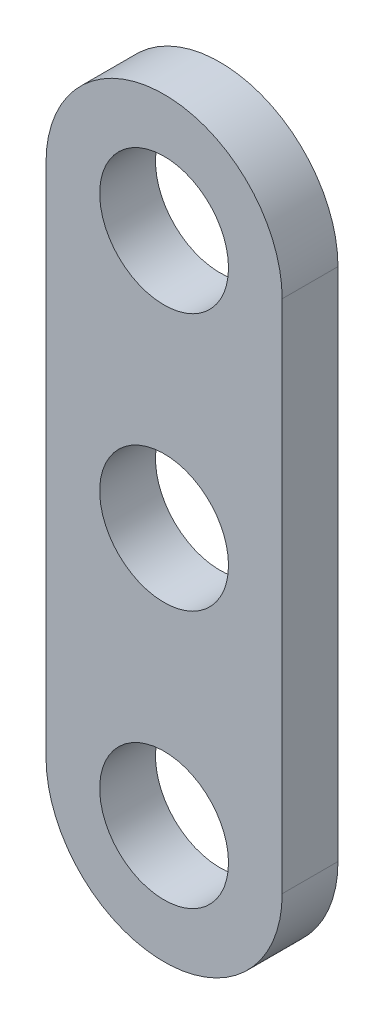
ISO-10303-21;
HEADER;
FILE_DESCRIPTION(('STEP AP214'),'2;1');
FILE_NAME('part.step','',(''),(''),'','','');
FILE_SCHEMA(('AUTOMOTIVE_DESIGN { 1 0 10303 214 1 1 1 1 }'));
ENDSEC;
DATA;
#1=APPLICATION_CONTEXT('core data for automotive mechanical design processes');
#2=APPLICATION_PROTOCOL_DEFINITION('international standard','automotive_design',2000,#1);
#3=PRODUCT_CONTEXT('',#1,'mechanical');
#4=PRODUCT('Part','Part','',(#3));
#5=PRODUCT_RELATED_PRODUCT_CATEGORY('part','',(#4));
#6=PRODUCT_DEFINITION_FORMATION('','',#4);
#7=PRODUCT_DEFINITION_CONTEXT('part definition',#1,'design');
#8=PRODUCT_DEFINITION('design','',#6,#7);
#9=PRODUCT_DEFINITION_SHAPE('','',#8);
#10=(LENGTH_UNIT() NAMED_UNIT(*) SI_UNIT(.MILLI.,.METRE.));
#11=(NAMED_UNIT(*) PLANE_ANGLE_UNIT() SI_UNIT($,.RADIAN.));
#12=(NAMED_UNIT(*) SI_UNIT($,.STERADIAN.) SOLID_ANGLE_UNIT());
#13=UNCERTAINTY_MEASURE_WITH_UNIT(LENGTH_MEASURE(1.E-05),#10,'distance_accuracy_value','');
#14=(GEOMETRIC_REPRESENTATION_CONTEXT(3) GLOBAL_UNCERTAINTY_ASSIGNED_CONTEXT((#13)) GLOBAL_UNIT_ASSIGNED_CONTEXT((#10,
#11,#12)) REPRESENTATION_CONTEXT('',''));
#15=CARTESIAN_POINT('',(0.,0.,0.));
#16=DIRECTION('',(0.,0.,1.));
#17=DIRECTION('',(1.,0.,0.));
#18=AXIS2_PLACEMENT_3D('',#15,#16,#17);
#19=CARTESIAN_POINT('',(0.,12.,2.6));
#20=DIRECTION('',(0.,0.,1.));
#21=DIRECTION('',(1.,0.,0.));
#22=AXIS2_PLACEMENT_3D('',#19,#20,#21);
#23=PLANE('',#22);
#24=CARTESIAN_POINT('',(0.,0.,2.6));
#25=DIRECTION('',(0.,0.,1.));
#26=DIRECTION('',(1.,0.,0.));
#27=AXIS2_PLACEMENT_3D('',#24,#25,#26);
#28=CIRCLE('',#27,3.);
#29=CARTESIAN_POINT('',(3.,0.,2.6));
#30=VERTEX_POINT('',#29);
#31=EDGE_CURVE('E134',#30,#30,#28,.T.);
#32=ORIENTED_EDGE('',*,*,#31,.F.);
#33=EDGE_LOOP('',(#32));
#34=FACE_BOUND('',#33,.T.);
#35=CARTESIAN_POINT('',(0.,12.,2.6));
#36=DIRECTION('',(0.,0.,1.));
#37=DIRECTION('',(1.,0.,0.));
#38=AXIS2_PLACEMENT_3D('',#35,#36,#37);
#39=CIRCLE('',#38,5.5);
#40=CARTESIAN_POINT('',(5.5,12.,2.6));
#41=VERTEX_POINT('',#40);
#42=CARTESIAN_POINT('',(-5.49999999999999,12.,2.6));
#43=VERTEX_POINT('',#42);
#44=EDGE_CURVE('E92',#41,#43,#39,.T.);
#45=ORIENTED_EDGE('',*,*,#44,.T.);
#46=DIRECTION('',(0.,-1.,0.));
#47=VECTOR('',#46,1.);
#48=CARTESIAN_POINT('',(-5.49999999999999,12.,2.6));
#49=LINE('',#48,#47);
#50=CARTESIAN_POINT('',(-5.5,-12.,2.6));
#51=VERTEX_POINT('',#50);
#52=EDGE_CURVE('E87',#43,#51,#49,.T.);
#53=ORIENTED_EDGE('',*,*,#52,.T.);
#54=CARTESIAN_POINT('',(0.,-12.,2.6));
#55=DIRECTION('',(0.,0.,1.));
#56=DIRECTION('',(1.,0.,0.));
#57=AXIS2_PLACEMENT_3D('',#54,#55,#56);
#58=CIRCLE('',#57,5.5);
#59=CARTESIAN_POINT('',(5.5,-12.,2.6));
#60=VERTEX_POINT('',#59);
#61=EDGE_CURVE('E90',#51,#60,#58,.T.);
#62=ORIENTED_EDGE('',*,*,#61,.T.);
#63=DIRECTION('',(0.,1.,0.));
#64=VECTOR('',#63,1.);
#65=CARTESIAN_POINT('',(5.5,12.,2.6));
#66=LINE('',#65,#64);
#67=EDGE_CURVE('E57',#60,#41,#66,.T.);
#68=ORIENTED_EDGE('',*,*,#67,.T.);
#69=EDGE_LOOP('',(#45,#53,#62,#68));
#70=FACE_BOUND('',#69,.T.);
#71=CARTESIAN_POINT('',(0.,-12.,2.6));
#72=DIRECTION('',(0.,0.,1.));
#73=DIRECTION('',(1.,0.,0.));
#74=AXIS2_PLACEMENT_3D('',#71,#72,#73);
#75=CIRCLE('',#74,3.);
#76=CARTESIAN_POINT('',(3.,-12.,2.6));
#77=VERTEX_POINT('',#76);
#78=EDGE_CURVE('E112',#77,#77,#75,.T.);
#79=ORIENTED_EDGE('',*,*,#78,.F.);
#80=EDGE_LOOP('',(#79));
#81=FACE_BOUND('',#80,.T.);
#82=CARTESIAN_POINT('',(0.,12.,2.6));
#83=DIRECTION('',(0.,0.,1.));
#84=DIRECTION('',(1.,0.,0.));
#85=AXIS2_PLACEMENT_3D('',#82,#83,#84);
#86=CIRCLE('',#85,3.);
#87=CARTESIAN_POINT('',(3.,12.,2.6));
#88=VERTEX_POINT('',#87);
#89=EDGE_CURVE('E142',#88,#88,#86,.T.);
#90=ORIENTED_EDGE('',*,*,#89,.F.);
#91=EDGE_LOOP('',(#90));
#92=FACE_BOUND('',#91,.T.);
#93=ADVANCED_FACE('F39',(#34,#70,#81,#92),#23,.T.);
#94=CARTESIAN_POINT('',(0.,12.,0.));
#95=DIRECTION('',(0.,0.,1.));
#96=DIRECTION('',(1.,0.,0.));
#97=AXIS2_PLACEMENT_3D('',#94,#95,#96);
#98=PLANE('',#97);
#99=CARTESIAN_POINT('',(0.,12.,0.));
#100=DIRECTION('',(0.,0.,1.));
#101=DIRECTION('',(1.,0.,0.));
#102=AXIS2_PLACEMENT_3D('',#99,#100,#101);
#103=CIRCLE('',#102,5.5);
#104=CARTESIAN_POINT('',(5.5,12.,0.));
#105=VERTEX_POINT('',#104);
#106=CARTESIAN_POINT('',(-5.49999999999999,12.,0.));
#107=VERTEX_POINT('',#106);
#108=EDGE_CURVE('E108',#105,#107,#103,.T.);
#109=ORIENTED_EDGE('',*,*,#108,.F.);
#110=DIRECTION('',(0.,1.,0.));
#111=VECTOR('',#110,1.);
#112=CARTESIAN_POINT('',(5.5,12.,0.));
#113=LINE('',#112,#111);
#114=CARTESIAN_POINT('',(5.5,-12.,0.));
#115=VERTEX_POINT('',#114);
#116=EDGE_CURVE('E80',#115,#105,#113,.T.);
#117=ORIENTED_EDGE('',*,*,#116,.F.);
#118=CARTESIAN_POINT('',(0.,-12.,0.));
#119=DIRECTION('',(0.,0.,1.));
#120=DIRECTION('',(1.,0.,0.));
#121=AXIS2_PLACEMENT_3D('',#118,#119,#120);
#122=CIRCLE('',#121,5.5);
#123=CARTESIAN_POINT('',(-5.5,-12.,0.));
#124=VERTEX_POINT('',#123);
#125=EDGE_CURVE('E74',#124,#115,#122,.T.);
#126=ORIENTED_EDGE('',*,*,#125,.F.);
#127=DIRECTION('',(0.,-1.,0.));
#128=VECTOR('',#127,1.);
#129=CARTESIAN_POINT('',(-5.49999999999999,12.,0.));
#130=LINE('',#129,#128);
#131=EDGE_CURVE('E97',#107,#124,#130,.T.);
#132=ORIENTED_EDGE('',*,*,#131,.F.);
#133=EDGE_LOOP('',(#109,#117,#126,#132));
#134=FACE_BOUND('',#133,.T.);
#135=CARTESIAN_POINT('',(0.,-12.,0.));
#136=DIRECTION('',(0.,0.,1.));
#137=DIRECTION('',(1.,0.,0.));
#138=AXIS2_PLACEMENT_3D('',#135,#136,#137);
#139=CIRCLE('',#138,3.);
#140=CARTESIAN_POINT('',(3.,-12.,0.));
#141=VERTEX_POINT('',#140);
#142=EDGE_CURVE('E130',#141,#141,#139,.T.);
#143=ORIENTED_EDGE('',*,*,#142,.T.);
#144=EDGE_LOOP('',(#143));
#145=FACE_BOUND('',#144,.T.);
#146=CARTESIAN_POINT('',(0.,0.,0.));
#147=DIRECTION('',(0.,0.,1.));
#148=DIRECTION('',(1.,0.,0.));
#149=AXIS2_PLACEMENT_3D('',#146,#147,#148);
#150=CIRCLE('',#149,3.);
#151=CARTESIAN_POINT('',(3.,0.,0.));
#152=VERTEX_POINT('',#151);
#153=EDGE_CURVE('E138',#152,#152,#150,.T.);
#154=ORIENTED_EDGE('',*,*,#153,.T.);
#155=EDGE_LOOP('',(#154));
#156=FACE_BOUND('',#155,.T.);
#157=CARTESIAN_POINT('',(0.,12.,0.));
#158=DIRECTION('',(0.,0.,1.));
#159=DIRECTION('',(1.,0.,0.));
#160=AXIS2_PLACEMENT_3D('',#157,#158,#159);
#161=CIRCLE('',#160,3.);
#162=CARTESIAN_POINT('',(3.,12.,0.));
#163=VERTEX_POINT('',#162);
#164=EDGE_CURVE('E146',#163,#163,#161,.T.);
#165=ORIENTED_EDGE('',*,*,#164,.T.);
#166=EDGE_LOOP('',(#165));
#167=FACE_BOUND('',#166,.T.);
#168=ADVANCED_FACE('F125',(#134,#145,#156,#167),#98,.F.);
#169=CARTESIAN_POINT('',(0.,12.,2.6));
#170=DIRECTION('',(0.,0.,-1.));
#171=DIRECTION('',(-1.,0.,0.));
#172=AXIS2_PLACEMENT_3D('',#169,#170,#171);
#173=CYLINDRICAL_SURFACE('',#172,5.5);
#174=ORIENTED_EDGE('',*,*,#108,.T.);
#175=DIRECTION('',(0.,0.,-1.));
#176=VECTOR('',#175,1.);
#177=CARTESIAN_POINT('',(-5.49999999999999,12.,2.6));
#178=LINE('',#177,#176);
#179=EDGE_CURVE('E11',#43,#107,#178,.T.);
#180=ORIENTED_EDGE('',*,*,#179,.F.);
#181=ORIENTED_EDGE('',*,*,#44,.F.);
#182=DIRECTION('',(0.,0.,-1.));
#183=VECTOR('',#182,1.);
#184=CARTESIAN_POINT('',(5.5,12.,2.6));
#185=LINE('',#184,#183);
#186=EDGE_CURVE('E104',#41,#105,#185,.T.);
#187=ORIENTED_EDGE('',*,*,#186,.T.);
#188=EDGE_LOOP('',(#174,#180,#181,#187));
#189=FACE_BOUND('',#188,.T.);
#190=ADVANCED_FACE('F41',(#189),#173,.T.);
#191=CARTESIAN_POINT('',(-5.49999999999999,12.,2.6));
#192=DIRECTION('',(1.,0.,0.));
#193=DIRECTION('',(0.,0.,-1.));
#194=AXIS2_PLACEMENT_3D('',#191,#192,#193);
#195=PLANE('',#194);
#196=ORIENTED_EDGE('',*,*,#131,.T.);
#197=DIRECTION('',(0.,0.,-1.));
#198=VECTOR('',#197,1.);
#199=CARTESIAN_POINT('',(-5.5,-12.,2.6));
#200=LINE('',#199,#198);
#201=EDGE_CURVE('E49',#51,#124,#200,.T.);
#202=ORIENTED_EDGE('',*,*,#201,.F.);
#203=ORIENTED_EDGE('',*,*,#52,.F.);
#204=ORIENTED_EDGE('',*,*,#179,.T.);
#205=EDGE_LOOP('',(#196,#202,#203,#204));
#206=FACE_BOUND('',#205,.T.);
#207=ADVANCED_FACE('F96',(#206),#195,.F.);
#208=CARTESIAN_POINT('',(0.,-12.,2.6));
#209=DIRECTION('',(0.,0.,-1.));
#210=DIRECTION('',(-1.,0.,0.));
#211=AXIS2_PLACEMENT_3D('',#208,#209,#210);
#212=CYLINDRICAL_SURFACE('',#211,5.5);
#213=ORIENTED_EDGE('',*,*,#125,.T.);
#214=DIRECTION('',(0.,0.,-1.));
#215=VECTOR('',#214,1.);
#216=CARTESIAN_POINT('',(5.5,-12.,2.6));
#217=LINE('',#216,#215);
#218=EDGE_CURVE('E99',#60,#115,#217,.T.);
#219=ORIENTED_EDGE('',*,*,#218,.F.);
#220=ORIENTED_EDGE('',*,*,#61,.F.);
#221=ORIENTED_EDGE('',*,*,#201,.T.);
#222=EDGE_LOOP('',(#213,#219,#220,#221));
#223=FACE_BOUND('',#222,.T.);
#224=ADVANCED_FACE('F100',(#223),#212,.T.);
#225=CARTESIAN_POINT('',(5.5,12.,2.6));
#226=DIRECTION('',(-1.,0.,0.));
#227=DIRECTION('',(0.,0.,1.));
#228=AXIS2_PLACEMENT_3D('',#225,#226,#227);
#229=PLANE('',#228);
#230=ORIENTED_EDGE('',*,*,#116,.T.);
#231=ORIENTED_EDGE('',*,*,#186,.F.);
#232=ORIENTED_EDGE('',*,*,#67,.F.);
#233=ORIENTED_EDGE('',*,*,#218,.T.);
#234=EDGE_LOOP('',(#230,#231,#232,#233));
#235=FACE_BOUND('',#234,.T.);
#236=ADVANCED_FACE('F122',(#235),#229,.F.);
#237=CARTESIAN_POINT('',(0.,-12.,2.6));
#238=DIRECTION('',(0.,0.,-1.));
#239=DIRECTION('',(-1.,0.,0.));
#240=AXIS2_PLACEMENT_3D('',#237,#238,#239);
#241=CYLINDRICAL_SURFACE('',#240,3.);
#242=ORIENTED_EDGE('',*,*,#78,.T.);
#243=EDGE_LOOP('',(#242));
#244=FACE_BOUND('',#243,.T.);
#245=ORIENTED_EDGE('',*,*,#142,.F.);
#246=EDGE_LOOP('',(#245));
#247=FACE_BOUND('',#246,.T.);
#248=ADVANCED_FACE('F166',(#244,#247),#241,.F.);
#249=CARTESIAN_POINT('',(0.,0.,2.6));
#250=DIRECTION('',(0.,0.,-1.));
#251=DIRECTION('',(-1.,0.,0.));
#252=AXIS2_PLACEMENT_3D('',#249,#250,#251);
#253=CYLINDRICAL_SURFACE('',#252,3.);
#254=ORIENTED_EDGE('',*,*,#31,.T.);
#255=EDGE_LOOP('',(#254));
#256=FACE_BOUND('',#255,.T.);
#257=ORIENTED_EDGE('',*,*,#153,.F.);
#258=EDGE_LOOP('',(#257));
#259=FACE_BOUND('',#258,.T.);
#260=ADVANCED_FACE('F212',(#256,#259),#253,.F.);
#261=CARTESIAN_POINT('',(0.,12.,2.6));
#262=DIRECTION('',(0.,0.,-1.));
#263=DIRECTION('',(-1.,0.,0.));
#264=AXIS2_PLACEMENT_3D('',#261,#262,#263);
#265=CYLINDRICAL_SURFACE('',#264,3.);
#266=ORIENTED_EDGE('',*,*,#89,.T.);
#267=EDGE_LOOP('',(#266));
#268=FACE_BOUND('',#267,.T.);
#269=ORIENTED_EDGE('',*,*,#164,.F.);
#270=EDGE_LOOP('',(#269));
#271=FACE_BOUND('',#270,.T.);
#272=ADVANCED_FACE('F154',(#268,#271),#265,.F.);
#273=CLOSED_SHELL('',(#93,#168,#190,#207,#224,#236,#248,#260,#272));
#274=MANIFOLD_SOLID_BREP('B2',#273);
#275=ADVANCED_BREP_SHAPE_REPRESENTATION('',(#18,#274),#14);
#276=SHAPE_DEFINITION_REPRESENTATION(#9,#275);
ENDSEC;
END-ISO-10303-21;
